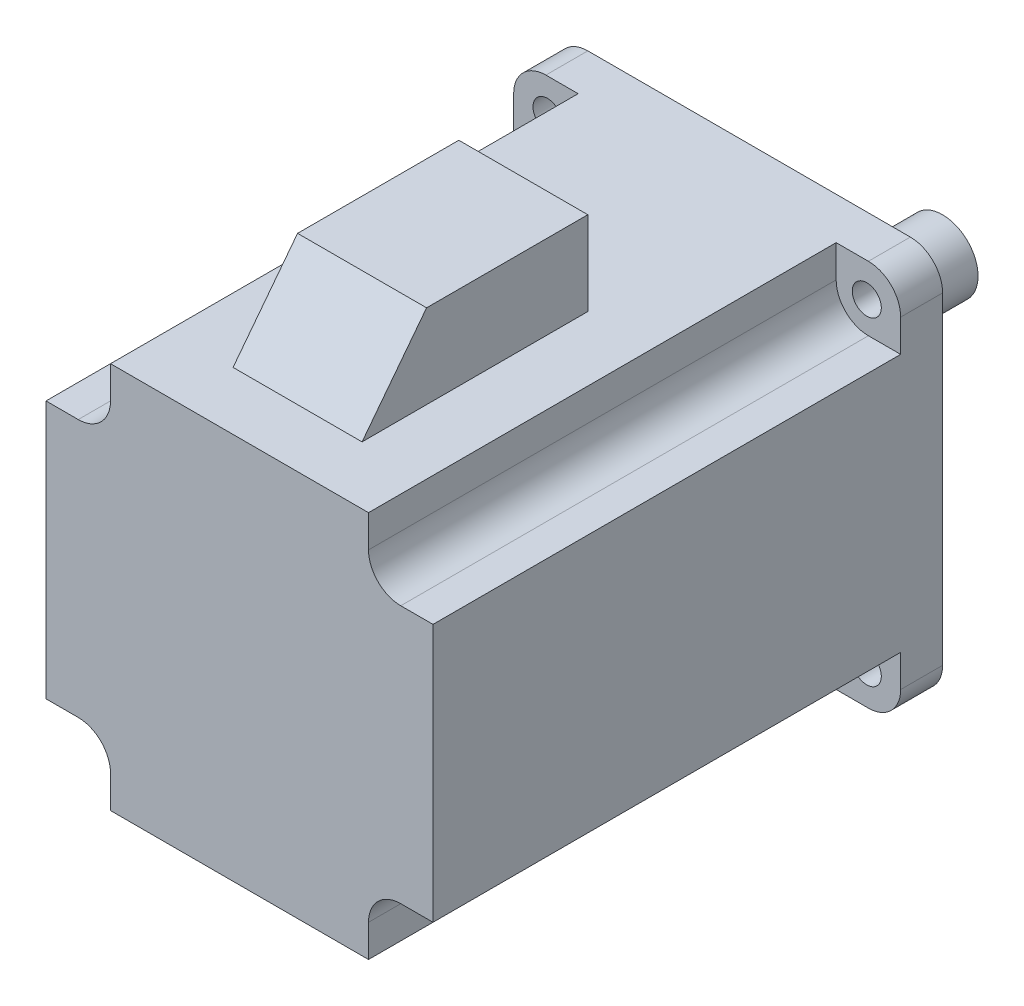
ISO-10303-21;
HEADER;
FILE_DESCRIPTION(('STEP AP214'),'2;1');
FILE_NAME('part.step','',(''),(''),'','','');
FILE_SCHEMA(('AUTOMOTIVE_DESIGN { 1 0 10303 214 1 1 1 1 }'));
ENDSEC;
DATA;
#1=APPLICATION_CONTEXT('core data for automotive mechanical design processes');
#2=APPLICATION_PROTOCOL_DEFINITION('international standard','automotive_design',2000,#1);
#3=PRODUCT_CONTEXT('',#1,'mechanical');
#4=PRODUCT('Part','Part','',(#3));
#5=PRODUCT_RELATED_PRODUCT_CATEGORY('part','',(#4));
#6=PRODUCT_DEFINITION_FORMATION('','',#4);
#7=PRODUCT_DEFINITION_CONTEXT('part definition',#1,'design');
#8=PRODUCT_DEFINITION('design','',#6,#7);
#9=PRODUCT_DEFINITION_SHAPE('','',#8);
#10=(LENGTH_UNIT() NAMED_UNIT(*) SI_UNIT(.MILLI.,.METRE.));
#11=(NAMED_UNIT(*) PLANE_ANGLE_UNIT() SI_UNIT($,.RADIAN.));
#12=(NAMED_UNIT(*) SI_UNIT($,.STERADIAN.) SOLID_ANGLE_UNIT());
#13=UNCERTAINTY_MEASURE_WITH_UNIT(LENGTH_MEASURE(1.E-05),#10,'distance_accuracy_value','');
#14=(GEOMETRIC_REPRESENTATION_CONTEXT(3) GLOBAL_UNCERTAINTY_ASSIGNED_CONTEXT((#13)) GLOBAL_UNIT_ASSIGNED_CONTEXT((#10,
#11,#12)) REPRESENTATION_CONTEXT('',''));
#15=CARTESIAN_POINT('',(0.,0.,0.));
#16=DIRECTION('',(0.,0.,1.));
#17=DIRECTION('',(1.,0.,0.));
#18=AXIS2_PLACEMENT_3D('',#15,#16,#17);
#19=CARTESIAN_POINT('',(0.,0.,-42.5));
#20=DIRECTION('',(0.,0.,-1.));
#21=DIRECTION('',(-1.,0.,0.));
#22=AXIS2_PLACEMENT_3D('',#19,#20,#21);
#23=PLANE('',#22);
#24=CARTESIAN_POINT('',(0.,0.,-42.5));
#25=DIRECTION('',(0.,0.,-1.));
#26=DIRECTION('',(-1.,0.,0.));
#27=AXIS2_PLACEMENT_3D('',#24,#25,#26);
#28=CIRCLE('',#27,25.);
#29=CARTESIAN_POINT('',(-25.,0.,-42.5));
#30=VERTEX_POINT('',#29);
#31=EDGE_CURVE('E340',#30,#30,#28,.T.);
#32=ORIENTED_EDGE('',*,*,#31,.T.);
#33=EDGE_LOOP('',(#32));
#34=FACE_BOUND('',#33,.T.);
#35=CARTESIAN_POINT('',(0.,0.,-42.5));
#36=DIRECTION('',(0.,0.,-1.));
#37=DIRECTION('',(-1.,0.,0.));
#38=AXIS2_PLACEMENT_3D('',#35,#36,#37);
#39=CIRCLE('',#38,5.5);
#40=CARTESIAN_POINT('',(-5.5,0.,-42.5));
#41=VERTEX_POINT('',#40);
#42=EDGE_CURVE('E333',#41,#41,#39,.T.);
#43=ORIENTED_EDGE('',*,*,#42,.F.);
#44=EDGE_LOOP('',(#43));
#45=FACE_BOUND('',#44,.T.);
#46=ADVANCED_FACE('F19',(#34,#45),#23,.T.);
#47=CARTESIAN_POINT('',(0.,0.,-39.5));
#48=DIRECTION('',(0.,0.,-1.));
#49=DIRECTION('',(-1.,0.,0.));
#50=AXIS2_PLACEMENT_3D('',#47,#48,#49);
#51=PLANE('',#50);
#52=CARTESIAN_POINT('',(24.7487373415294,-24.748737341529,-39.5));
#53=DIRECTION('',(0.,0.,-1.));
#54=DIRECTION('',(0.,1.,0.));
#55=AXIS2_PLACEMENT_3D('',#52,#53,#54);
#56=CIRCLE('',#55,2.25);
#57=CARTESIAN_POINT('',(24.7487373415294,-22.498737341529,-39.5));
#58=VERTEX_POINT('',#57);
#59=EDGE_CURVE('E237',#58,#58,#56,.T.);
#60=ORIENTED_EDGE('',*,*,#59,.F.);
#61=EDGE_LOOP('',(#60));
#62=FACE_BOUND('',#61,.T.);
#63=CARTESIAN_POINT('',(-24.7487373415292,-24.7487373415291,-39.5));
#64=DIRECTION('',(0.,0.,-1.));
#65=DIRECTION('',(1.,0.,0.));
#66=AXIS2_PLACEMENT_3D('',#63,#64,#65);
#67=CIRCLE('',#66,2.25);
#68=CARTESIAN_POINT('',(-22.4987373415292,-24.7487373415291,-39.5));
#69=VERTEX_POINT('',#68);
#70=EDGE_CURVE('E241',#69,#69,#67,.T.);
#71=ORIENTED_EDGE('',*,*,#70,.F.);
#72=EDGE_LOOP('',(#71));
#73=FACE_BOUND('',#72,.T.);
#74=CARTESIAN_POINT('',(-24.7487373415292,24.7487373415292,-39.5));
#75=DIRECTION('',(0.,0.,-1.));
#76=DIRECTION('',(0.,-1.,0.));
#77=AXIS2_PLACEMENT_3D('',#74,#75,#76);
#78=CIRCLE('',#77,2.25);
#79=CARTESIAN_POINT('',(-24.7487373415292,22.4987373415292,-39.5));
#80=VERTEX_POINT('',#79);
#81=EDGE_CURVE('E245',#80,#80,#78,.T.);
#82=ORIENTED_EDGE('',*,*,#81,.F.);
#83=EDGE_LOOP('',(#82));
#84=FACE_BOUND('',#83,.T.);
#85=CARTESIAN_POINT('',(24.7487373415292,24.7487373415291,-39.5));
#86=DIRECTION('',(0.,0.,-1.));
#87=DIRECTION('',(-1.,0.,0.));
#88=AXIS2_PLACEMENT_3D('',#85,#86,#87);
#89=CIRCLE('',#88,2.25);
#90=CARTESIAN_POINT('',(22.4987373415292,24.7487373415291,-39.5));
#91=VERTEX_POINT('',#90);
#92=EDGE_CURVE('E249',#91,#91,#89,.T.);
#93=ORIENTED_EDGE('',*,*,#92,.F.);
#94=EDGE_LOOP('',(#93));
#95=FACE_BOUND('',#94,.T.);
#96=DIRECTION('',(0.,1.,0.));
#97=VECTOR('',#96,1.);
#98=CARTESIAN_POINT('',(30.,-30.,-39.5));
#99=LINE('',#98,#97);
#100=CARTESIAN_POINT('',(30.,-25.,-39.5));
#101=VERTEX_POINT('',#100);
#102=CARTESIAN_POINT('',(30.,25.,-39.5));
#103=VERTEX_POINT('',#102);
#104=EDGE_CURVE('E343',#101,#103,#99,.T.);
#105=ORIENTED_EDGE('',*,*,#104,.F.);
#106=CARTESIAN_POINT('',(25.,-25.,-39.5));
#107=DIRECTION('',(0.,0.,-1.));
#108=DIRECTION('',(-1.,0.,0.));
#109=AXIS2_PLACEMENT_3D('',#106,#107,#108);
#110=CIRCLE('',#109,5.);
#111=CARTESIAN_POINT('',(25.,-30.,-39.5));
#112=VERTEX_POINT('',#111);
#113=EDGE_CURVE('E424',#101,#112,#110,.T.);
#114=ORIENTED_EDGE('',*,*,#113,.T.);
#115=DIRECTION('',(1.,0.,0.));
#116=VECTOR('',#115,1.);
#117=CARTESIAN_POINT('',(-30.,-30.,-39.5));
#118=LINE('',#117,#116);
#119=CARTESIAN_POINT('',(-25.,-30.,-39.5));
#120=VERTEX_POINT('',#119);
#121=EDGE_CURVE('E350',#120,#112,#118,.T.);
#122=ORIENTED_EDGE('',*,*,#121,.F.);
#123=CARTESIAN_POINT('',(-25.,-25.,-39.5));
#124=DIRECTION('',(0.,0.,-1.));
#125=DIRECTION('',(-1.,0.,0.));
#126=AXIS2_PLACEMENT_3D('',#123,#124,#125);
#127=CIRCLE('',#126,5.);
#128=CARTESIAN_POINT('',(-30.,-25.,-39.5));
#129=VERTEX_POINT('',#128);
#130=EDGE_CURVE('E422',#120,#129,#127,.T.);
#131=ORIENTED_EDGE('',*,*,#130,.T.);
#132=DIRECTION('',(0.,-1.,0.));
#133=VECTOR('',#132,1.);
#134=CARTESIAN_POINT('',(-30.,-30.,-39.5));
#135=LINE('',#134,#133);
#136=CARTESIAN_POINT('',(-30.,25.,-39.5));
#137=VERTEX_POINT('',#136);
#138=EDGE_CURVE('E365',#137,#129,#135,.T.);
#139=ORIENTED_EDGE('',*,*,#138,.F.);
#140=CARTESIAN_POINT('',(-25.,25.,-39.5));
#141=DIRECTION('',(0.,0.,-1.));
#142=DIRECTION('',(-1.,0.,0.));
#143=AXIS2_PLACEMENT_3D('',#140,#141,#142);
#144=CIRCLE('',#143,5.);
#145=CARTESIAN_POINT('',(-25.,30.,-39.5));
#146=VERTEX_POINT('',#145);
#147=EDGE_CURVE('E420',#137,#146,#144,.T.);
#148=ORIENTED_EDGE('',*,*,#147,.T.);
#149=DIRECTION('',(-1.,0.,0.));
#150=VECTOR('',#149,1.);
#151=CARTESIAN_POINT('',(-30.,30.,-39.5));
#152=LINE('',#151,#150);
#153=CARTESIAN_POINT('',(25.,30.,-39.5));
#154=VERTEX_POINT('',#153);
#155=EDGE_CURVE('E362',#154,#146,#152,.T.);
#156=ORIENTED_EDGE('',*,*,#155,.F.);
#157=CARTESIAN_POINT('',(25.,25.,-39.5));
#158=DIRECTION('',(0.,0.,-1.));
#159=DIRECTION('',(-1.,0.,0.));
#160=AXIS2_PLACEMENT_3D('',#157,#158,#159);
#161=CIRCLE('',#160,5.);
#162=EDGE_CURVE('E418',#154,#103,#161,.T.);
#163=ORIENTED_EDGE('',*,*,#162,.T.);
#164=EDGE_LOOP('',(#105,#114,#122,#131,#139,#148,#156,#163));
#165=FACE_BOUND('',#164,.T.);
#166=CARTESIAN_POINT('',(0.,0.,-39.5));
#167=DIRECTION('',(0.,0.,-1.));
#168=DIRECTION('',(-1.,0.,0.));
#169=AXIS2_PLACEMENT_3D('',#166,#167,#168);
#170=CIRCLE('',#169,25.);
#171=CARTESIAN_POINT('',(-25.,0.,-39.5));
#172=VERTEX_POINT('',#171);
#173=EDGE_CURVE('E337',#172,#172,#170,.T.);
#174=ORIENTED_EDGE('',*,*,#173,.F.);
#175=EDGE_LOOP('',(#174));
#176=FACE_BOUND('',#175,.T.);
#177=ADVANCED_FACE('F481',(#62,#73,#84,#95,#165,#176),#51,.T.);
#178=CARTESIAN_POINT('',(30.,-30.,39.5));
#179=DIRECTION('',(-1.,0.,0.));
#180=DIRECTION('',(0.,0.,1.));
#181=AXIS2_PLACEMENT_3D('',#178,#179,#180);
#182=PLANE('',#181);
#183=DIRECTION('',(0.,1.,0.));
#184=VECTOR('',#183,1.);
#185=CARTESIAN_POINT('',(30.,-30.,-33.));
#186=LINE('',#185,#184);
#187=CARTESIAN_POINT('',(30.,-25.,-33.));
#188=VERTEX_POINT('',#187);
#189=CARTESIAN_POINT('',(30.,-20.,-33.));
#190=VERTEX_POINT('',#189);
#191=EDGE_CURVE('E262',#188,#190,#186,.T.);
#192=ORIENTED_EDGE('',*,*,#191,.F.);
#193=DIRECTION('',(0.,0.,-1.));
#194=VECTOR('',#193,1.);
#195=CARTESIAN_POINT('',(30.,-25.,39.5));
#196=LINE('',#195,#194);
#197=EDGE_CURVE('E415',#188,#101,#196,.T.);
#198=ORIENTED_EDGE('',*,*,#197,.T.);
#199=ORIENTED_EDGE('',*,*,#104,.T.);
#200=DIRECTION('',(0.,0.,-1.));
#201=VECTOR('',#200,1.);
#202=CARTESIAN_POINT('',(30.,25.,39.5));
#203=LINE('',#202,#201);
#204=CARTESIAN_POINT('',(30.,25.,-33.));
#205=VERTEX_POINT('',#204);
#206=EDGE_CURVE('E413',#103,#205,#203,.F.);
#207=ORIENTED_EDGE('',*,*,#206,.T.);
#208=DIRECTION('',(0.,1.,0.));
#209=VECTOR('',#208,1.);
#210=CARTESIAN_POINT('',(30.,30.,-33.));
#211=LINE('',#210,#209);
#212=CARTESIAN_POINT('',(30.,20.,-33.));
#213=VERTEX_POINT('',#212);
#214=EDGE_CURVE('E301',#213,#205,#211,.T.);
#215=ORIENTED_EDGE('',*,*,#214,.F.);
#216=DIRECTION('',(0.,0.,1.));
#217=VECTOR('',#216,1.);
#218=CARTESIAN_POINT('',(30.,20.,-53.642135623731));
#219=LINE('',#218,#217);
#220=CARTESIAN_POINT('',(30.,20.,39.5));
#221=VERTEX_POINT('',#220);
#222=EDGE_CURVE('E305',#213,#221,#219,.T.);
#223=ORIENTED_EDGE('',*,*,#222,.T.);
#224=DIRECTION('',(0.,1.,0.));
#225=VECTOR('',#224,1.);
#226=CARTESIAN_POINT('',(30.,-30.,39.5));
#227=LINE('',#226,#225);
#228=CARTESIAN_POINT('',(30.,-20.,39.5));
#229=VERTEX_POINT('',#228);
#230=EDGE_CURVE('E346',#229,#221,#227,.T.);
#231=ORIENTED_EDGE('',*,*,#230,.F.);
#232=DIRECTION('',(0.,0.,1.));
#233=VECTOR('',#232,1.);
#234=CARTESIAN_POINT('',(30.,-20.,-53.642135623731));
#235=LINE('',#234,#233);
#236=EDGE_CURVE('E264',#190,#229,#235,.T.);
#237=ORIENTED_EDGE('',*,*,#236,.F.);
#238=EDGE_LOOP('',(#192,#198,#199,#207,#215,#223,#231,#237));
#239=FACE_BOUND('',#238,.T.);
#240=ADVANCED_FACE('F490',(#239),#182,.F.);
#241=CARTESIAN_POINT('',(-30.,30.,39.5));
#242=DIRECTION('',(0.,-1.,0.));
#243=DIRECTION('',(0.,0.,-1.));
#244=AXIS2_PLACEMENT_3D('',#241,#242,#243);
#245=PLANE('',#244);
#246=DIRECTION('',(-1.,0.,0.));
#247=VECTOR('',#246,1.);
#248=CARTESIAN_POINT('',(10.,30.,-4.5));
#249=LINE('',#248,#247);
#250=CARTESIAN_POINT('',(10.,30.,-4.5));
#251=VERTEX_POINT('',#250);
#252=CARTESIAN_POINT('',(-10.,30.,-4.5));
#253=VERTEX_POINT('',#252);
#254=EDGE_CURVE('E34',#251,#253,#249,.T.);
#255=ORIENTED_EDGE('',*,*,#254,.F.);
#256=DIRECTION('',(0.,0.,-1.));
#257=VECTOR('',#256,1.);
#258=CARTESIAN_POINT('',(10.,30.,-4.5));
#259=LINE('',#258,#257);
#260=CARTESIAN_POINT('',(10.,30.,30.5));
#261=VERTEX_POINT('',#260);
#262=EDGE_CURVE('E39',#261,#251,#259,.T.);
#263=ORIENTED_EDGE('',*,*,#262,.F.);
#264=DIRECTION('',(-1.,0.,0.));
#265=VECTOR('',#264,1.);
#266=CARTESIAN_POINT('',(10.,30.,30.5));
#267=LINE('',#266,#265);
#268=CARTESIAN_POINT('',(-10.,30.,30.5));
#269=VERTEX_POINT('',#268);
#270=EDGE_CURVE('E222',#261,#269,#267,.T.);
#271=ORIENTED_EDGE('',*,*,#270,.T.);
#272=DIRECTION('',(0.,0.,-1.));
#273=VECTOR('',#272,1.);
#274=CARTESIAN_POINT('',(-10.,30.,-4.5));
#275=LINE('',#274,#273);
#276=EDGE_CURVE('E226',#269,#253,#275,.T.);
#277=ORIENTED_EDGE('',*,*,#276,.T.);
#278=EDGE_LOOP('',(#255,#263,#271,#277));
#279=FACE_BOUND('',#278,.T.);
#280=ORIENTED_EDGE('',*,*,#155,.T.);
#281=DIRECTION('',(0.,0.,-1.));
#282=VECTOR('',#281,1.);
#283=CARTESIAN_POINT('',(-25.,30.,39.5));
#284=LINE('',#283,#282);
#285=CARTESIAN_POINT('',(-25.,30.,-33.));
#286=VERTEX_POINT('',#285);
#287=EDGE_CURVE('E439',#146,#286,#284,.F.);
#288=ORIENTED_EDGE('',*,*,#287,.T.);
#289=DIRECTION('',(-1.,0.,0.));
#290=VECTOR('',#289,1.);
#291=CARTESIAN_POINT('',(-30.,30.,-33.));
#292=LINE('',#291,#290);
#293=CARTESIAN_POINT('',(-20.,30.,-33.));
#294=VERTEX_POINT('',#293);
#295=EDGE_CURVE('E325',#294,#286,#292,.T.);
#296=ORIENTED_EDGE('',*,*,#295,.F.);
#297=DIRECTION('',(0.,0.,1.));
#298=VECTOR('',#297,1.);
#299=CARTESIAN_POINT('',(-20.,30.,-53.642135623731));
#300=LINE('',#299,#298);
#301=CARTESIAN_POINT('',(-20.,30.,39.5));
#302=VERTEX_POINT('',#301);
#303=EDGE_CURVE('E328',#294,#302,#300,.T.);
#304=ORIENTED_EDGE('',*,*,#303,.T.);
#305=DIRECTION('',(-1.,0.,0.));
#306=VECTOR('',#305,1.);
#307=CARTESIAN_POINT('',(-30.,30.,39.5));
#308=LINE('',#307,#306);
#309=CARTESIAN_POINT('',(20.,30.,39.5));
#310=VERTEX_POINT('',#309);
#311=EDGE_CURVE('E349',#310,#302,#308,.T.);
#312=ORIENTED_EDGE('',*,*,#311,.F.);
#313=DIRECTION('',(0.,0.,1.));
#314=VECTOR('',#313,1.);
#315=CARTESIAN_POINT('',(20.,30.,-53.642135623731));
#316=LINE('',#315,#314);
#317=CARTESIAN_POINT('',(20.,30.,-33.));
#318=VERTEX_POINT('',#317);
#319=EDGE_CURVE('E300',#318,#310,#316,.T.);
#320=ORIENTED_EDGE('',*,*,#319,.F.);
#321=DIRECTION('',(-1.,0.,0.));
#322=VECTOR('',#321,1.);
#323=CARTESIAN_POINT('',(30.,30.,-33.));
#324=LINE('',#323,#322);
#325=CARTESIAN_POINT('',(25.,30.,-33.));
#326=VERTEX_POINT('',#325);
#327=EDGE_CURVE('E296',#326,#318,#324,.T.);
#328=ORIENTED_EDGE('',*,*,#327,.F.);
#329=DIRECTION('',(0.,0.,-1.));
#330=VECTOR('',#329,1.);
#331=CARTESIAN_POINT('',(25.,30.,39.5));
#332=LINE('',#331,#330);
#333=EDGE_CURVE('E436',#326,#154,#332,.T.);
#334=ORIENTED_EDGE('',*,*,#333,.T.);
#335=EDGE_LOOP('',(#280,#288,#296,#304,#312,#320,#328,#334));
#336=FACE_BOUND('',#335,.T.);
#337=ADVANCED_FACE('F531',(#279,#336),#245,.F.);
#338=CARTESIAN_POINT('',(-30.,-30.,39.5));
#339=DIRECTION('',(1.,0.,0.));
#340=DIRECTION('',(0.,1.,0.));
#341=AXIS2_PLACEMENT_3D('',#338,#339,#340);
#342=PLANE('',#341);
#343=ORIENTED_EDGE('',*,*,#138,.T.);
#344=DIRECTION('',(0.,0.,-1.));
#345=VECTOR('',#344,1.);
#346=CARTESIAN_POINT('',(-30.,-25.,39.5));
#347=LINE('',#346,#345);
#348=CARTESIAN_POINT('',(-30.,-25.,-33.));
#349=VERTEX_POINT('',#348);
#350=EDGE_CURVE('E434',#129,#349,#347,.F.);
#351=ORIENTED_EDGE('',*,*,#350,.T.);
#352=DIRECTION('',(0.,-1.,0.));
#353=VECTOR('',#352,1.);
#354=CARTESIAN_POINT('',(-30.,-30.,-33.));
#355=LINE('',#354,#353);
#356=CARTESIAN_POINT('',(-30.,-20.,-33.));
#357=VERTEX_POINT('',#356);
#358=EDGE_CURVE('E281',#357,#349,#355,.T.);
#359=ORIENTED_EDGE('',*,*,#358,.F.);
#360=DIRECTION('',(0.,0.,1.));
#361=VECTOR('',#360,1.);
#362=CARTESIAN_POINT('',(-30.,-20.,-53.642135623731));
#363=LINE('',#362,#361);
#364=CARTESIAN_POINT('',(-30.,-20.,39.5));
#365=VERTEX_POINT('',#364);
#366=EDGE_CURVE('E285',#357,#365,#363,.T.);
#367=ORIENTED_EDGE('',*,*,#366,.T.);
#368=DIRECTION('',(0.,-1.,0.));
#369=VECTOR('',#368,1.);
#370=CARTESIAN_POINT('',(-30.,-30.,39.5));
#371=LINE('',#370,#369);
#372=CARTESIAN_POINT('',(-30.,20.,39.5));
#373=VERTEX_POINT('',#372);
#374=EDGE_CURVE('E353',#373,#365,#371,.T.);
#375=ORIENTED_EDGE('',*,*,#374,.F.);
#376=DIRECTION('',(0.,0.,1.));
#377=VECTOR('',#376,1.);
#378=CARTESIAN_POINT('',(-30.,20.,-53.642135623731));
#379=LINE('',#378,#377);
#380=CARTESIAN_POINT('',(-30.,20.,-33.));
#381=VERTEX_POINT('',#380);
#382=EDGE_CURVE('E324',#381,#373,#379,.T.);
#383=ORIENTED_EDGE('',*,*,#382,.F.);
#384=DIRECTION('',(0.,-1.,0.));
#385=VECTOR('',#384,1.);
#386=CARTESIAN_POINT('',(-30.,30.,-33.));
#387=LINE('',#386,#385);
#388=CARTESIAN_POINT('',(-30.,25.,-33.));
#389=VERTEX_POINT('',#388);
#390=EDGE_CURVE('E322',#389,#381,#387,.T.);
#391=ORIENTED_EDGE('',*,*,#390,.F.);
#392=DIRECTION('',(0.,0.,-1.));
#393=VECTOR('',#392,1.);
#394=CARTESIAN_POINT('',(-30.,25.,39.5));
#395=LINE('',#394,#393);
#396=EDGE_CURVE('E431',#389,#137,#395,.T.);
#397=ORIENTED_EDGE('',*,*,#396,.T.);
#398=EDGE_LOOP('',(#343,#351,#359,#367,#375,#383,#391,#397));
#399=FACE_BOUND('',#398,.T.);
#400=ADVANCED_FACE('F468',(#399),#342,.F.);
#401=CARTESIAN_POINT('',(-30.,-30.,39.5));
#402=DIRECTION('',(0.,1.,0.));
#403=DIRECTION('',(0.,0.,1.));
#404=AXIS2_PLACEMENT_3D('',#401,#402,#403);
#405=PLANE('',#404);
#406=ORIENTED_EDGE('',*,*,#121,.T.);
#407=DIRECTION('',(0.,0.,-1.));
#408=VECTOR('',#407,1.);
#409=CARTESIAN_POINT('',(25.,-30.,39.5));
#410=LINE('',#409,#408);
#411=CARTESIAN_POINT('',(25.,-30.,-33.));
#412=VERTEX_POINT('',#411);
#413=EDGE_CURVE('E429',#112,#412,#410,.F.);
#414=ORIENTED_EDGE('',*,*,#413,.T.);
#415=DIRECTION('',(1.,0.,0.));
#416=VECTOR('',#415,1.);
#417=CARTESIAN_POINT('',(30.,-30.,-33.));
#418=LINE('',#417,#416);
#419=CARTESIAN_POINT('',(20.,-30.,-33.));
#420=VERTEX_POINT('',#419);
#421=EDGE_CURVE('E265',#420,#412,#418,.T.);
#422=ORIENTED_EDGE('',*,*,#421,.F.);
#423=DIRECTION('',(0.,0.,1.));
#424=VECTOR('',#423,1.);
#425=CARTESIAN_POINT('',(20.,-30.,-53.642135623731));
#426=LINE('',#425,#424);
#427=CARTESIAN_POINT('',(20.,-30.,39.5));
#428=VERTEX_POINT('',#427);
#429=EDGE_CURVE('E268',#420,#428,#426,.T.);
#430=ORIENTED_EDGE('',*,*,#429,.T.);
#431=DIRECTION('',(1.,0.,0.));
#432=VECTOR('',#431,1.);
#433=CARTESIAN_POINT('',(-30.,-30.,39.5));
#434=LINE('',#433,#432);
#435=CARTESIAN_POINT('',(-20.,-30.,39.5));
#436=VERTEX_POINT('',#435);
#437=EDGE_CURVE('E356',#436,#428,#434,.T.);
#438=ORIENTED_EDGE('',*,*,#437,.F.);
#439=DIRECTION('',(0.,0.,1.));
#440=VECTOR('',#439,1.);
#441=CARTESIAN_POINT('',(-20.,-30.,-53.642135623731));
#442=LINE('',#441,#440);
#443=CARTESIAN_POINT('',(-20.,-30.,-33.));
#444=VERTEX_POINT('',#443);
#445=EDGE_CURVE('E280',#444,#436,#442,.T.);
#446=ORIENTED_EDGE('',*,*,#445,.F.);
#447=DIRECTION('',(1.,0.,0.));
#448=VECTOR('',#447,1.);
#449=CARTESIAN_POINT('',(-30.,-30.,-33.));
#450=LINE('',#449,#448);
#451=CARTESIAN_POINT('',(-25.,-30.,-33.));
#452=VERTEX_POINT('',#451);
#453=EDGE_CURVE('E276',#452,#444,#450,.T.);
#454=ORIENTED_EDGE('',*,*,#453,.F.);
#455=DIRECTION('',(0.,0.,-1.));
#456=VECTOR('',#455,1.);
#457=CARTESIAN_POINT('',(-25.,-30.,39.5));
#458=LINE('',#457,#456);
#459=EDGE_CURVE('E426',#452,#120,#458,.T.);
#460=ORIENTED_EDGE('',*,*,#459,.T.);
#461=EDGE_LOOP('',(#406,#414,#422,#430,#438,#446,#454,#460));
#462=FACE_BOUND('',#461,.T.);
#463=ADVANCED_FACE('F477',(#462),#405,.F.);
#464=CARTESIAN_POINT('',(0.,0.,39.5));
#465=DIRECTION('',(0.,0.,-1.));
#466=DIRECTION('',(-1.,0.,0.));
#467=AXIS2_PLACEMENT_3D('',#464,#465,#466);
#468=PLANE('',#467);
#469=DIRECTION('',(0.,-1.,0.));
#470=VECTOR('',#469,1.);
#471=CARTESIAN_POINT('',(20.,-30.,39.5));
#472=LINE('',#471,#470);
#473=CARTESIAN_POINT('',(20.,-25.,39.5));
#474=VERTEX_POINT('',#473);
#475=EDGE_CURVE('E253',#474,#428,#472,.T.);
#476=ORIENTED_EDGE('',*,*,#475,.F.);
#477=CARTESIAN_POINT('',(25.,-25.,39.5));
#478=DIRECTION('',(0.,0.,-1.));
#479=DIRECTION('',(-1.,0.,0.));
#480=AXIS2_PLACEMENT_3D('',#477,#478,#479);
#481=CIRCLE('',#480,5.);
#482=CARTESIAN_POINT('',(25.,-20.,39.5));
#483=VERTEX_POINT('',#482);
#484=EDGE_CURVE('E12',#474,#483,#481,.T.);
#485=ORIENTED_EDGE('',*,*,#484,.T.);
#486=DIRECTION('',(-1.,0.,0.));
#487=VECTOR('',#486,1.);
#488=CARTESIAN_POINT('',(30.,-20.,39.5));
#489=LINE('',#488,#487);
#490=EDGE_CURVE('E256',#229,#483,#489,.T.);
#491=ORIENTED_EDGE('',*,*,#490,.F.);
#492=ORIENTED_EDGE('',*,*,#230,.T.);
#493=DIRECTION('',(1.,0.,0.));
#494=VECTOR('',#493,1.);
#495=CARTESIAN_POINT('',(30.,20.,39.5));
#496=LINE('',#495,#494);
#497=CARTESIAN_POINT('',(25.,20.,39.5));
#498=VERTEX_POINT('',#497);
#499=EDGE_CURVE('E294',#498,#221,#496,.T.);
#500=ORIENTED_EDGE('',*,*,#499,.F.);
#501=CARTESIAN_POINT('',(25.,25.,39.5));
#502=DIRECTION('',(0.,0.,-1.));
#503=DIRECTION('',(-1.,0.,0.));
#504=AXIS2_PLACEMENT_3D('',#501,#502,#503);
#505=CIRCLE('',#504,5.);
#506=CARTESIAN_POINT('',(20.,25.,39.5));
#507=VERTEX_POINT('',#506);
#508=EDGE_CURVE('E441',#498,#507,#505,.T.);
#509=ORIENTED_EDGE('',*,*,#508,.T.);
#510=DIRECTION('',(0.,-1.,0.));
#511=VECTOR('',#510,1.);
#512=CARTESIAN_POINT('',(20.,30.,39.5));
#513=LINE('',#512,#511);
#514=EDGE_CURVE('E284',#310,#507,#513,.T.);
#515=ORIENTED_EDGE('',*,*,#514,.F.);
#516=ORIENTED_EDGE('',*,*,#311,.T.);
#517=DIRECTION('',(0.,1.,0.));
#518=VECTOR('',#517,1.);
#519=CARTESIAN_POINT('',(-20.,30.,39.5));
#520=LINE('',#519,#518);
#521=CARTESIAN_POINT('',(-20.,25.,39.5));
#522=VERTEX_POINT('',#521);
#523=EDGE_CURVE('E314',#522,#302,#520,.T.);
#524=ORIENTED_EDGE('',*,*,#523,.F.);
#525=CARTESIAN_POINT('',(-25.,25.,39.5));
#526=DIRECTION('',(0.,0.,-1.));
#527=DIRECTION('',(-1.,0.,0.));
#528=AXIS2_PLACEMENT_3D('',#525,#526,#527);
#529=CIRCLE('',#528,5.);
#530=CARTESIAN_POINT('',(-25.,20.,39.5));
#531=VERTEX_POINT('',#530);
#532=EDGE_CURVE('E443',#522,#531,#529,.T.);
#533=ORIENTED_EDGE('',*,*,#532,.T.);
#534=DIRECTION('',(1.,0.,0.));
#535=VECTOR('',#534,1.);
#536=CARTESIAN_POINT('',(-30.,20.,39.5));
#537=LINE('',#536,#535);
#538=EDGE_CURVE('E304',#373,#531,#537,.T.);
#539=ORIENTED_EDGE('',*,*,#538,.F.);
#540=ORIENTED_EDGE('',*,*,#374,.T.);
#541=DIRECTION('',(-1.,0.,0.));
#542=VECTOR('',#541,1.);
#543=CARTESIAN_POINT('',(-30.,-20.,39.5));
#544=LINE('',#543,#542);
#545=CARTESIAN_POINT('',(-25.,-20.,39.5));
#546=VERTEX_POINT('',#545);
#547=EDGE_CURVE('E274',#546,#365,#544,.T.);
#548=ORIENTED_EDGE('',*,*,#547,.F.);
#549=CARTESIAN_POINT('',(-25.,-25.,39.5));
#550=DIRECTION('',(0.,0.,-1.));
#551=DIRECTION('',(-1.,0.,0.));
#552=AXIS2_PLACEMENT_3D('',#549,#550,#551);
#553=CIRCLE('',#552,5.);
#554=CARTESIAN_POINT('',(-20.,-25.,39.5));
#555=VERTEX_POINT('',#554);
#556=EDGE_CURVE('E27',#546,#555,#553,.T.);
#557=ORIENTED_EDGE('',*,*,#556,.T.);
#558=DIRECTION('',(0.,1.,0.));
#559=VECTOR('',#558,1.);
#560=CARTESIAN_POINT('',(-20.,-30.,39.5));
#561=LINE('',#560,#559);
#562=EDGE_CURVE('E273',#436,#555,#561,.T.);
#563=ORIENTED_EDGE('',*,*,#562,.F.);
#564=ORIENTED_EDGE('',*,*,#437,.T.);
#565=EDGE_LOOP('',(#476,#485,#491,#492,#500,#509,#515,#516,#524,#533,#539,#540,#548,#557,#563,#564));
#566=FACE_BOUND('',#565,.T.);
#567=ADVANCED_FACE('F448',(#566),#468,.F.);
#568=CARTESIAN_POINT('',(0.,0.,-42.5));
#569=DIRECTION('',(0.,0.,1.));
#570=DIRECTION('',(1.,0.,0.));
#571=AXIS2_PLACEMENT_3D('',#568,#569,#570);
#572=CYLINDRICAL_SURFACE('',#571,25.);
#573=ORIENTED_EDGE('',*,*,#31,.F.);
#574=EDGE_LOOP('',(#573));
#575=FACE_BOUND('',#574,.T.);
#576=ORIENTED_EDGE('',*,*,#173,.T.);
#577=EDGE_LOOP('',(#576));
#578=FACE_BOUND('',#577,.T.);
#579=ADVANCED_FACE('F580',(#575,#578),#572,.T.);
#580=CARTESIAN_POINT('',(0.,0.,-69.5));
#581=DIRECTION('',(0.,0.,1.));
#582=DIRECTION('',(1.,0.,0.));
#583=AXIS2_PLACEMENT_3D('',#580,#581,#582);
#584=CYLINDRICAL_SURFACE('',#583,5.5);
#585=CARTESIAN_POINT('',(0.,0.,-69.5));
#586=DIRECTION('',(0.,0.,-1.));
#587=DIRECTION('',(-1.,0.,0.));
#588=AXIS2_PLACEMENT_3D('',#585,#586,#587);
#589=CIRCLE('',#588,5.5);
#590=CARTESIAN_POINT('',(-5.5,0.,-69.5));
#591=VERTEX_POINT('',#590);
#592=EDGE_CURVE('E334',#591,#591,#589,.T.);
#593=ORIENTED_EDGE('',*,*,#592,.F.);
#594=EDGE_LOOP('',(#593));
#595=FACE_BOUND('',#594,.T.);
#596=ORIENTED_EDGE('',*,*,#42,.T.);
#597=EDGE_LOOP('',(#596));
#598=FACE_BOUND('',#597,.T.);
#599=ADVANCED_FACE('F578',(#595,#598),#584,.T.);
#600=CARTESIAN_POINT('',(0.,0.,-69.5));
#601=DIRECTION('',(0.,0.,-1.));
#602=DIRECTION('',(-1.,0.,0.));
#603=AXIS2_PLACEMENT_3D('',#600,#601,#602);
#604=PLANE('',#603);
#605=ORIENTED_EDGE('',*,*,#592,.T.);
#606=EDGE_LOOP('',(#605));
#607=FACE_BOUND('',#606,.T.);
#608=ADVANCED_FACE('F794',(#607),#604,.T.);
#609=CARTESIAN_POINT('',(0.,0.,-33.));
#610=DIRECTION('',(0.,0.,-1.));
#611=DIRECTION('',(-1.,0.,0.));
#612=AXIS2_PLACEMENT_3D('',#609,#610,#611);
#613=PLANE('',#612);
#614=CARTESIAN_POINT('',(-24.7487373415292,24.7487373415292,-33.));
#615=DIRECTION('',(0.,0.,-1.));
#616=DIRECTION('',(-1.,0.,0.));
#617=AXIS2_PLACEMENT_3D('',#614,#615,#616);
#618=CIRCLE('',#617,2.25);
#619=CARTESIAN_POINT('',(-26.9987373415292,24.7487373415292,-33.));
#620=VERTEX_POINT('',#619);
#621=EDGE_CURVE('E248',#620,#620,#618,.T.);
#622=ORIENTED_EDGE('',*,*,#621,.T.);
#623=EDGE_LOOP('',(#622));
#624=FACE_BOUND('',#623,.T.);
#625=DIRECTION('',(1.,0.,0.));
#626=VECTOR('',#625,1.);
#627=CARTESIAN_POINT('',(-30.,20.,-33.));
#628=LINE('',#627,#626);
#629=CARTESIAN_POINT('',(-25.,20.,-33.));
#630=VERTEX_POINT('',#629);
#631=EDGE_CURVE('E316',#381,#630,#628,.T.);
#632=ORIENTED_EDGE('',*,*,#631,.T.);
#633=CARTESIAN_POINT('',(-25.,25.,-33.));
#634=DIRECTION('',(0.,0.,-1.));
#635=DIRECTION('',(-1.,0.,0.));
#636=AXIS2_PLACEMENT_3D('',#633,#634,#635);
#637=CIRCLE('',#636,5.);
#638=CARTESIAN_POINT('',(-20.,25.,-33.));
#639=VERTEX_POINT('',#638);
#640=EDGE_CURVE('E393',#630,#639,#637,.F.);
#641=ORIENTED_EDGE('',*,*,#640,.T.);
#642=DIRECTION('',(0.,1.,0.));
#643=VECTOR('',#642,1.);
#644=CARTESIAN_POINT('',(-20.,30.,-33.));
#645=LINE('',#644,#643);
#646=EDGE_CURVE('E321',#639,#294,#645,.T.);
#647=ORIENTED_EDGE('',*,*,#646,.T.);
#648=ORIENTED_EDGE('',*,*,#295,.T.);
#649=CARTESIAN_POINT('',(-25.,25.,-33.));
#650=DIRECTION('',(0.,0.,-1.));
#651=DIRECTION('',(-1.,0.,0.));
#652=AXIS2_PLACEMENT_3D('',#649,#650,#651);
#653=CIRCLE('',#652,5.);
#654=EDGE_CURVE('E391',#286,#389,#653,.F.);
#655=ORIENTED_EDGE('',*,*,#654,.T.);
#656=ORIENTED_EDGE('',*,*,#390,.T.);
#657=EDGE_LOOP('',(#632,#641,#647,#648,#655,#656));
#658=FACE_BOUND('',#657,.T.);
#659=ADVANCED_FACE('F550',(#624,#658),#613,.F.);
#660=CARTESIAN_POINT('',(-30.,20.,-53.642135623731));
#661=DIRECTION('',(0.,-1.,0.));
#662=DIRECTION('',(0.,0.,-1.));
#663=AXIS2_PLACEMENT_3D('',#660,#661,#662);
#664=PLANE('',#663);
#665=ORIENTED_EDGE('',*,*,#538,.T.);
#666=DIRECTION('',(0.,0.,1.));
#667=VECTOR('',#666,1.);
#668=CARTESIAN_POINT('',(-25.,20.,-33.));
#669=LINE('',#668,#667);
#670=EDGE_CURVE('E389',#531,#630,#669,.F.);
#671=ORIENTED_EDGE('',*,*,#670,.T.);
#672=ORIENTED_EDGE('',*,*,#631,.F.);
#673=ORIENTED_EDGE('',*,*,#382,.T.);
#674=EDGE_LOOP('',(#665,#671,#672,#673));
#675=FACE_BOUND('',#674,.T.);
#676=ADVANCED_FACE('F547',(#675),#664,.F.);
#677=CARTESIAN_POINT('',(-20.,30.,-53.642135623731));
#678=DIRECTION('',(1.,0.,0.));
#679=DIRECTION('',(0.,0.,-1.));
#680=AXIS2_PLACEMENT_3D('',#677,#678,#679);
#681=PLANE('',#680);
#682=ORIENTED_EDGE('',*,*,#646,.F.);
#683=DIRECTION('',(0.,0.,1.));
#684=VECTOR('',#683,1.);
#685=CARTESIAN_POINT('',(-20.,25.,39.5));
#686=LINE('',#685,#684);
#687=EDGE_CURVE('E386',#639,#522,#686,.T.);
#688=ORIENTED_EDGE('',*,*,#687,.T.);
#689=ORIENTED_EDGE('',*,*,#523,.T.);
#690=ORIENTED_EDGE('',*,*,#303,.F.);
#691=EDGE_LOOP('',(#682,#688,#689,#690));
#692=FACE_BOUND('',#691,.T.);
#693=ADVANCED_FACE('F539',(#692),#681,.F.);
#694=CARTESIAN_POINT('',(0.,0.,-33.));
#695=DIRECTION('',(0.,0.,-1.));
#696=DIRECTION('',(-1.,0.,0.));
#697=AXIS2_PLACEMENT_3D('',#694,#695,#696);
#698=PLANE('',#697);
#699=CARTESIAN_POINT('',(24.7487373415292,24.7487373415291,-33.));
#700=DIRECTION('',(0.,0.,-1.));
#701=DIRECTION('',(-1.,0.,0.));
#702=AXIS2_PLACEMENT_3D('',#699,#700,#701);
#703=CIRCLE('',#702,2.25);
#704=CARTESIAN_POINT('',(22.4987373415292,24.7487373415291,-33.));
#705=VERTEX_POINT('',#704);
#706=EDGE_CURVE('E252',#705,#705,#703,.T.);
#707=ORIENTED_EDGE('',*,*,#706,.T.);
#708=EDGE_LOOP('',(#707));
#709=FACE_BOUND('',#708,.T.);
#710=DIRECTION('',(0.,-1.,0.));
#711=VECTOR('',#710,1.);
#712=CARTESIAN_POINT('',(20.,30.,-33.));
#713=LINE('',#712,#711);
#714=CARTESIAN_POINT('',(20.,25.,-33.));
#715=VERTEX_POINT('',#714);
#716=EDGE_CURVE('E308',#318,#715,#713,.T.);
#717=ORIENTED_EDGE('',*,*,#716,.T.);
#718=CARTESIAN_POINT('',(25.,25.,-33.));
#719=DIRECTION('',(0.,0.,-1.));
#720=DIRECTION('',(-1.,0.,0.));
#721=AXIS2_PLACEMENT_3D('',#718,#719,#720);
#722=CIRCLE('',#721,5.);
#723=CARTESIAN_POINT('',(25.,20.,-33.));
#724=VERTEX_POINT('',#723);
#725=EDGE_CURVE('E384',#715,#724,#722,.F.);
#726=ORIENTED_EDGE('',*,*,#725,.T.);
#727=DIRECTION('',(1.,0.,0.));
#728=VECTOR('',#727,1.);
#729=CARTESIAN_POINT('',(30.,20.,-33.));
#730=LINE('',#729,#728);
#731=EDGE_CURVE('E306',#724,#213,#730,.T.);
#732=ORIENTED_EDGE('',*,*,#731,.T.);
#733=ORIENTED_EDGE('',*,*,#214,.T.);
#734=CARTESIAN_POINT('',(25.,25.,-33.));
#735=DIRECTION('',(0.,0.,-1.));
#736=DIRECTION('',(-1.,0.,0.));
#737=AXIS2_PLACEMENT_3D('',#734,#735,#736);
#738=CIRCLE('',#737,5.);
#739=EDGE_CURVE('E382',#205,#326,#738,.F.);
#740=ORIENTED_EDGE('',*,*,#739,.T.);
#741=ORIENTED_EDGE('',*,*,#327,.T.);
#742=EDGE_LOOP('',(#717,#726,#732,#733,#740,#741));
#743=FACE_BOUND('',#742,.T.);
#744=ADVANCED_FACE('F528',(#709,#743),#698,.F.);
#745=CARTESIAN_POINT('',(20.,30.,-53.642135623731));
#746=DIRECTION('',(-1.,0.,0.));
#747=DIRECTION('',(0.,-1.,0.));
#748=AXIS2_PLACEMENT_3D('',#745,#746,#747);
#749=PLANE('',#748);
#750=ORIENTED_EDGE('',*,*,#514,.T.);
#751=DIRECTION('',(0.,0.,1.));
#752=VECTOR('',#751,1.);
#753=CARTESIAN_POINT('',(20.,25.,-33.));
#754=LINE('',#753,#752);
#755=EDGE_CURVE('E380',#507,#715,#754,.F.);
#756=ORIENTED_EDGE('',*,*,#755,.T.);
#757=ORIENTED_EDGE('',*,*,#716,.F.);
#758=ORIENTED_EDGE('',*,*,#319,.T.);
#759=EDGE_LOOP('',(#750,#756,#757,#758));
#760=FACE_BOUND('',#759,.T.);
#761=ADVANCED_FACE('F522',(#760),#749,.F.);
#762=CARTESIAN_POINT('',(30.,20.,-53.642135623731));
#763=DIRECTION('',(0.,-1.,0.));
#764=DIRECTION('',(1.,0.,0.));
#765=AXIS2_PLACEMENT_3D('',#762,#763,#764);
#766=PLANE('',#765);
#767=ORIENTED_EDGE('',*,*,#731,.F.);
#768=DIRECTION('',(0.,0.,1.));
#769=VECTOR('',#768,1.);
#770=CARTESIAN_POINT('',(25.,20.,39.5));
#771=LINE('',#770,#769);
#772=EDGE_CURVE('E359',#724,#498,#771,.T.);
#773=ORIENTED_EDGE('',*,*,#772,.T.);
#774=ORIENTED_EDGE('',*,*,#499,.T.);
#775=ORIENTED_EDGE('',*,*,#222,.F.);
#776=EDGE_LOOP('',(#767,#773,#774,#775));
#777=FACE_BOUND('',#776,.T.);
#778=ADVANCED_FACE('F515',(#777),#766,.F.);
#779=CARTESIAN_POINT('',(0.,0.,-33.));
#780=DIRECTION('',(0.,0.,-1.));
#781=DIRECTION('',(-1.,0.,0.));
#782=AXIS2_PLACEMENT_3D('',#779,#780,#781);
#783=PLANE('',#782);
#784=CARTESIAN_POINT('',(-24.7487373415292,-24.7487373415291,-33.));
#785=DIRECTION('',(0.,0.,-1.));
#786=DIRECTION('',(-1.,0.,0.));
#787=AXIS2_PLACEMENT_3D('',#784,#785,#786);
#788=CIRCLE('',#787,2.25);
#789=CARTESIAN_POINT('',(-26.9987373415292,-24.7487373415291,-33.));
#790=VERTEX_POINT('',#789);
#791=EDGE_CURVE('E244',#790,#790,#788,.T.);
#792=ORIENTED_EDGE('',*,*,#791,.T.);
#793=EDGE_LOOP('',(#792));
#794=FACE_BOUND('',#793,.T.);
#795=DIRECTION('',(0.,1.,0.));
#796=VECTOR('',#795,1.);
#797=CARTESIAN_POINT('',(-20.,-30.,-33.));
#798=LINE('',#797,#796);
#799=CARTESIAN_POINT('',(-20.,-25.,-33.));
#800=VERTEX_POINT('',#799);
#801=EDGE_CURVE('E288',#444,#800,#798,.T.);
#802=ORIENTED_EDGE('',*,*,#801,.T.);
#803=CARTESIAN_POINT('',(-25.,-25.,-33.));
#804=DIRECTION('',(0.,0.,-1.));
#805=DIRECTION('',(-1.,0.,0.));
#806=AXIS2_PLACEMENT_3D('',#803,#804,#805);
#807=CIRCLE('',#806,5.);
#808=CARTESIAN_POINT('',(-25.,-20.,-33.));
#809=VERTEX_POINT('',#808);
#810=EDGE_CURVE('E402',#800,#809,#807,.F.);
#811=ORIENTED_EDGE('',*,*,#810,.T.);
#812=DIRECTION('',(-1.,0.,0.));
#813=VECTOR('',#812,1.);
#814=CARTESIAN_POINT('',(-30.,-20.,-33.));
#815=LINE('',#814,#813);
#816=EDGE_CURVE('E286',#809,#357,#815,.T.);
#817=ORIENTED_EDGE('',*,*,#816,.T.);
#818=ORIENTED_EDGE('',*,*,#358,.T.);
#819=CARTESIAN_POINT('',(-25.,-25.,-33.));
#820=DIRECTION('',(0.,0.,-1.));
#821=DIRECTION('',(-1.,0.,0.));
#822=AXIS2_PLACEMENT_3D('',#819,#820,#821);
#823=CIRCLE('',#822,5.);
#824=EDGE_CURVE('E400',#349,#452,#823,.F.);
#825=ORIENTED_EDGE('',*,*,#824,.T.);
#826=ORIENTED_EDGE('',*,*,#453,.T.);
#827=EDGE_LOOP('',(#802,#811,#817,#818,#825,#826));
#828=FACE_BOUND('',#827,.T.);
#829=ADVANCED_FACE('F461',(#794,#828),#783,.F.);
#830=CARTESIAN_POINT('',(-20.,-30.,-53.642135623731));
#831=DIRECTION('',(1.,0.,0.));
#832=DIRECTION('',(0.,0.,-1.));
#833=AXIS2_PLACEMENT_3D('',#830,#831,#832);
#834=PLANE('',#833);
#835=ORIENTED_EDGE('',*,*,#562,.T.);
#836=DIRECTION('',(0.,0.,1.));
#837=VECTOR('',#836,1.);
#838=CARTESIAN_POINT('',(-20.,-25.,-33.));
#839=LINE('',#838,#837);
#840=EDGE_CURVE('E398',#555,#800,#839,.F.);
#841=ORIENTED_EDGE('',*,*,#840,.T.);
#842=ORIENTED_EDGE('',*,*,#801,.F.);
#843=ORIENTED_EDGE('',*,*,#445,.T.);
#844=EDGE_LOOP('',(#835,#841,#842,#843));
#845=FACE_BOUND('',#844,.T.);
#846=ADVANCED_FACE('F454',(#845),#834,.F.);
#847=CARTESIAN_POINT('',(-30.,-20.,-53.642135623731));
#848=DIRECTION('',(0.,1.,0.));
#849=DIRECTION('',(0.,0.,1.));
#850=AXIS2_PLACEMENT_3D('',#847,#848,#849);
#851=PLANE('',#850);
#852=ORIENTED_EDGE('',*,*,#816,.F.);
#853=DIRECTION('',(0.,0.,1.));
#854=VECTOR('',#853,1.);
#855=CARTESIAN_POINT('',(-25.,-20.,39.5));
#856=LINE('',#855,#854);
#857=EDGE_CURVE('E395',#809,#546,#856,.T.);
#858=ORIENTED_EDGE('',*,*,#857,.T.);
#859=ORIENTED_EDGE('',*,*,#547,.T.);
#860=ORIENTED_EDGE('',*,*,#366,.F.);
#861=EDGE_LOOP('',(#852,#858,#859,#860));
#862=FACE_BOUND('',#861,.T.);
#863=ADVANCED_FACE('F464',(#862),#851,.F.);
#864=CARTESIAN_POINT('',(0.,0.,-33.));
#865=DIRECTION('',(0.,0.,-1.));
#866=DIRECTION('',(-1.,0.,0.));
#867=AXIS2_PLACEMENT_3D('',#864,#865,#866);
#868=PLANE('',#867);
#869=CARTESIAN_POINT('',(24.7487373415294,-24.748737341529,-33.));
#870=DIRECTION('',(0.,0.,-1.));
#871=DIRECTION('',(-1.,0.,0.));
#872=AXIS2_PLACEMENT_3D('',#869,#870,#871);
#873=CIRCLE('',#872,2.25);
#874=CARTESIAN_POINT('',(22.4987373415294,-24.748737341529,-33.));
#875=VERTEX_POINT('',#874);
#876=EDGE_CURVE('E240',#875,#875,#873,.T.);
#877=ORIENTED_EDGE('',*,*,#876,.T.);
#878=EDGE_LOOP('',(#877));
#879=FACE_BOUND('',#878,.T.);
#880=DIRECTION('',(-1.,0.,0.));
#881=VECTOR('',#880,1.);
#882=CARTESIAN_POINT('',(30.,-20.,-33.));
#883=LINE('',#882,#881);
#884=CARTESIAN_POINT('',(25.,-20.,-33.));
#885=VERTEX_POINT('',#884);
#886=EDGE_CURVE('E255',#190,#885,#883,.T.);
#887=ORIENTED_EDGE('',*,*,#886,.T.);
#888=CARTESIAN_POINT('',(25.,-25.,-33.));
#889=DIRECTION('',(0.,0.,-1.));
#890=DIRECTION('',(-1.,0.,0.));
#891=AXIS2_PLACEMENT_3D('',#888,#889,#890);
#892=CIRCLE('',#891,5.);
#893=CARTESIAN_POINT('',(20.,-25.,-33.));
#894=VERTEX_POINT('',#893);
#895=EDGE_CURVE('E411',#885,#894,#892,.F.);
#896=ORIENTED_EDGE('',*,*,#895,.T.);
#897=DIRECTION('',(0.,-1.,0.));
#898=VECTOR('',#897,1.);
#899=CARTESIAN_POINT('',(20.,-30.,-33.));
#900=LINE('',#899,#898);
#901=EDGE_CURVE('E261',#894,#420,#900,.T.);
#902=ORIENTED_EDGE('',*,*,#901,.T.);
#903=ORIENTED_EDGE('',*,*,#421,.T.);
#904=CARTESIAN_POINT('',(25.,-25.,-33.));
#905=DIRECTION('',(0.,0.,-1.));
#906=DIRECTION('',(-1.,0.,0.));
#907=AXIS2_PLACEMENT_3D('',#904,#905,#906);
#908=CIRCLE('',#907,5.);
#909=EDGE_CURVE('E409',#412,#188,#908,.F.);
#910=ORIENTED_EDGE('',*,*,#909,.T.);
#911=ORIENTED_EDGE('',*,*,#191,.T.);
#912=EDGE_LOOP('',(#887,#896,#902,#903,#910,#911));
#913=FACE_BOUND('',#912,.T.);
#914=ADVANCED_FACE('F496',(#879,#913),#868,.F.);
#915=CARTESIAN_POINT('',(30.,-20.,-53.642135623731));
#916=DIRECTION('',(0.,1.,0.));
#917=DIRECTION('',(0.,0.,1.));
#918=AXIS2_PLACEMENT_3D('',#915,#916,#917);
#919=PLANE('',#918);
#920=ORIENTED_EDGE('',*,*,#490,.T.);
#921=DIRECTION('',(0.,0.,1.));
#922=VECTOR('',#921,1.);
#923=CARTESIAN_POINT('',(25.,-20.,-33.));
#924=LINE('',#923,#922);
#925=EDGE_CURVE('E407',#483,#885,#924,.F.);
#926=ORIENTED_EDGE('',*,*,#925,.T.);
#927=ORIENTED_EDGE('',*,*,#886,.F.);
#928=ORIENTED_EDGE('',*,*,#236,.T.);
#929=EDGE_LOOP('',(#920,#926,#927,#928));
#930=FACE_BOUND('',#929,.T.);
#931=ADVANCED_FACE('F499',(#930),#919,.F.);
#932=CARTESIAN_POINT('',(20.,-30.,-53.642135623731));
#933=DIRECTION('',(-1.,0.,0.));
#934=DIRECTION('',(0.,0.,1.));
#935=AXIS2_PLACEMENT_3D('',#932,#933,#934);
#936=PLANE('',#935);
#937=ORIENTED_EDGE('',*,*,#901,.F.);
#938=DIRECTION('',(0.,0.,1.));
#939=VECTOR('',#938,1.);
#940=CARTESIAN_POINT('',(20.,-25.,39.5));
#941=LINE('',#940,#939);
#942=EDGE_CURVE('E404',#894,#474,#941,.T.);
#943=ORIENTED_EDGE('',*,*,#942,.T.);
#944=ORIENTED_EDGE('',*,*,#475,.T.);
#945=ORIENTED_EDGE('',*,*,#429,.F.);
#946=EDGE_LOOP('',(#937,#943,#944,#945));
#947=FACE_BOUND('',#946,.T.);
#948=ADVANCED_FACE('F508',(#947),#936,.F.);
#949=CARTESIAN_POINT('',(24.7487373415292,24.7487373415291,39.5));
#950=DIRECTION('',(0.,0.,-1.));
#951=DIRECTION('',(-1.,0.,0.));
#952=AXIS2_PLACEMENT_3D('',#949,#950,#951);
#953=CYLINDRICAL_SURFACE('',#952,2.25);
#954=ORIENTED_EDGE('',*,*,#92,.T.);
#955=EDGE_LOOP('',(#954));
#956=FACE_BOUND('',#955,.T.);
#957=ORIENTED_EDGE('',*,*,#706,.F.);
#958=EDGE_LOOP('',(#957));
#959=FACE_BOUND('',#958,.T.);
#960=ADVANCED_FACE('F697',(#956,#959),#953,.F.);
#961=CARTESIAN_POINT('',(-24.7487373415292,24.7487373415292,39.5));
#962=DIRECTION('',(0.,0.,-1.));
#963=DIRECTION('',(-1.,0.,0.));
#964=AXIS2_PLACEMENT_3D('',#961,#962,#963);
#965=CYLINDRICAL_SURFACE('',#964,2.25);
#966=ORIENTED_EDGE('',*,*,#81,.T.);
#967=EDGE_LOOP('',(#966));
#968=FACE_BOUND('',#967,.T.);
#969=ORIENTED_EDGE('',*,*,#621,.F.);
#970=EDGE_LOOP('',(#969));
#971=FACE_BOUND('',#970,.T.);
#972=ADVANCED_FACE('F688',(#968,#971),#965,.F.);
#973=CARTESIAN_POINT('',(-24.7487373415292,-24.7487373415291,39.5));
#974=DIRECTION('',(0.,0.,-1.));
#975=DIRECTION('',(-1.,0.,0.));
#976=AXIS2_PLACEMENT_3D('',#973,#974,#975);
#977=CYLINDRICAL_SURFACE('',#976,2.25);
#978=ORIENTED_EDGE('',*,*,#70,.T.);
#979=EDGE_LOOP('',(#978));
#980=FACE_BOUND('',#979,.T.);
#981=ORIENTED_EDGE('',*,*,#791,.F.);
#982=EDGE_LOOP('',(#981));
#983=FACE_BOUND('',#982,.T.);
#984=ADVANCED_FACE('F678',(#980,#983),#977,.F.);
#985=CARTESIAN_POINT('',(24.7487373415294,-24.748737341529,39.5));
#986=DIRECTION('',(0.,0.,-1.));
#987=DIRECTION('',(-1.,0.,0.));
#988=AXIS2_PLACEMENT_3D('',#985,#986,#987);
#989=CYLINDRICAL_SURFACE('',#988,2.25);
#990=ORIENTED_EDGE('',*,*,#59,.T.);
#991=EDGE_LOOP('',(#990));
#992=FACE_BOUND('',#991,.T.);
#993=ORIENTED_EDGE('',*,*,#876,.F.);
#994=EDGE_LOOP('',(#993));
#995=FACE_BOUND('',#994,.T.);
#996=ADVANCED_FACE('F596',(#992,#995),#989,.F.);
#997=CARTESIAN_POINT('',(25.,25.,-53.642135623731));
#998=DIRECTION('',(0.,0.,-1.));
#999=DIRECTION('',(-1.,0.,0.));
#1000=AXIS2_PLACEMENT_3D('',#997,#998,#999);
#1001=CYLINDRICAL_SURFACE('',#1000,5.);
#1002=ORIENTED_EDGE('',*,*,#725,.F.);
#1003=ORIENTED_EDGE('',*,*,#755,.F.);
#1004=ORIENTED_EDGE('',*,*,#508,.F.);
#1005=ORIENTED_EDGE('',*,*,#772,.F.);
#1006=EDGE_LOOP('',(#1002,#1003,#1004,#1005));
#1007=FACE_BOUND('',#1006,.T.);
#1008=ADVANCED_FACE('F526',(#1007),#1001,.F.);
#1009=CARTESIAN_POINT('',(-25.,25.,-53.642135623731));
#1010=DIRECTION('',(0.,0.,-1.));
#1011=DIRECTION('',(-1.,0.,0.));
#1012=AXIS2_PLACEMENT_3D('',#1009,#1010,#1011);
#1013=CYLINDRICAL_SURFACE('',#1012,5.);
#1014=ORIENTED_EDGE('',*,*,#640,.F.);
#1015=ORIENTED_EDGE('',*,*,#670,.F.);
#1016=ORIENTED_EDGE('',*,*,#532,.F.);
#1017=ORIENTED_EDGE('',*,*,#687,.F.);
#1018=EDGE_LOOP('',(#1014,#1015,#1016,#1017));
#1019=FACE_BOUND('',#1018,.T.);
#1020=ADVANCED_FACE('F543',(#1019),#1013,.F.);
#1021=CARTESIAN_POINT('',(-25.,-25.,-53.642135623731));
#1022=DIRECTION('',(0.,0.,-1.));
#1023=DIRECTION('',(-1.,0.,0.));
#1024=AXIS2_PLACEMENT_3D('',#1021,#1022,#1023);
#1025=CYLINDRICAL_SURFACE('',#1024,5.);
#1026=ORIENTED_EDGE('',*,*,#810,.F.);
#1027=ORIENTED_EDGE('',*,*,#840,.F.);
#1028=ORIENTED_EDGE('',*,*,#556,.F.);
#1029=ORIENTED_EDGE('',*,*,#857,.F.);
#1030=EDGE_LOOP('',(#1026,#1027,#1028,#1029));
#1031=FACE_BOUND('',#1030,.T.);
#1032=ADVANCED_FACE('F458',(#1031),#1025,.F.);
#1033=CARTESIAN_POINT('',(25.,-25.,-53.642135623731));
#1034=DIRECTION('',(0.,0.,-1.));
#1035=DIRECTION('',(-1.,0.,0.));
#1036=AXIS2_PLACEMENT_3D('',#1033,#1034,#1035);
#1037=CYLINDRICAL_SURFACE('',#1036,5.);
#1038=ORIENTED_EDGE('',*,*,#895,.F.);
#1039=ORIENTED_EDGE('',*,*,#925,.F.);
#1040=ORIENTED_EDGE('',*,*,#484,.F.);
#1041=ORIENTED_EDGE('',*,*,#942,.F.);
#1042=EDGE_LOOP('',(#1038,#1039,#1040,#1041));
#1043=FACE_BOUND('',#1042,.T.);
#1044=ADVANCED_FACE('F503',(#1043),#1037,.F.);
#1045=CARTESIAN_POINT('',(25.,-25.,39.5));
#1046=DIRECTION('',(0.,0.,-1.));
#1047=DIRECTION('',(-1.,0.,0.));
#1048=AXIS2_PLACEMENT_3D('',#1045,#1046,#1047);
#1049=CYLINDRICAL_SURFACE('',#1048,5.);
#1050=ORIENTED_EDGE('',*,*,#909,.F.);
#1051=ORIENTED_EDGE('',*,*,#413,.F.);
#1052=ORIENTED_EDGE('',*,*,#113,.F.);
#1053=ORIENTED_EDGE('',*,*,#197,.F.);
#1054=EDGE_LOOP('',(#1050,#1051,#1052,#1053));
#1055=FACE_BOUND('',#1054,.T.);
#1056=ADVANCED_FACE('F487',(#1055),#1049,.T.);
#1057=CARTESIAN_POINT('',(-25.,-25.,39.5));
#1058=DIRECTION('',(0.,0.,-1.));
#1059=DIRECTION('',(-1.,0.,0.));
#1060=AXIS2_PLACEMENT_3D('',#1057,#1058,#1059);
#1061=CYLINDRICAL_SURFACE('',#1060,5.);
#1062=ORIENTED_EDGE('',*,*,#824,.F.);
#1063=ORIENTED_EDGE('',*,*,#350,.F.);
#1064=ORIENTED_EDGE('',*,*,#130,.F.);
#1065=ORIENTED_EDGE('',*,*,#459,.F.);
#1066=EDGE_LOOP('',(#1062,#1063,#1064,#1065));
#1067=FACE_BOUND('',#1066,.T.);
#1068=ADVANCED_FACE('F474',(#1067),#1061,.T.);
#1069=CARTESIAN_POINT('',(-25.,25.,39.5));
#1070=DIRECTION('',(0.,0.,-1.));
#1071=DIRECTION('',(-1.,0.,0.));
#1072=AXIS2_PLACEMENT_3D('',#1069,#1070,#1071);
#1073=CYLINDRICAL_SURFACE('',#1072,5.);
#1074=ORIENTED_EDGE('',*,*,#654,.F.);
#1075=ORIENTED_EDGE('',*,*,#287,.F.);
#1076=ORIENTED_EDGE('',*,*,#147,.F.);
#1077=ORIENTED_EDGE('',*,*,#396,.F.);
#1078=EDGE_LOOP('',(#1074,#1075,#1076,#1077));
#1079=FACE_BOUND('',#1078,.T.);
#1080=ADVANCED_FACE('F555',(#1079),#1073,.T.);
#1081=CARTESIAN_POINT('',(25.,25.,39.5));
#1082=DIRECTION('',(0.,0.,-1.));
#1083=DIRECTION('',(-1.,0.,0.));
#1084=AXIS2_PLACEMENT_3D('',#1081,#1082,#1083);
#1085=CYLINDRICAL_SURFACE('',#1084,5.);
#1086=ORIENTED_EDGE('',*,*,#739,.F.);
#1087=ORIENTED_EDGE('',*,*,#206,.F.);
#1088=ORIENTED_EDGE('',*,*,#162,.F.);
#1089=ORIENTED_EDGE('',*,*,#333,.F.);
#1090=EDGE_LOOP('',(#1086,#1087,#1088,#1089));
#1091=FACE_BOUND('',#1090,.T.);
#1092=ADVANCED_FACE('F21',(#1091),#1085,.T.);
#1093=CARTESIAN_POINT('',(10.,43.,-4.5));
#1094=DIRECTION('',(0.,0.,1.));
#1095=DIRECTION('',(1.,0.,0.));
#1096=AXIS2_PLACEMENT_3D('',#1093,#1094,#1095);
#1097=PLANE('',#1096);
#1098=DIRECTION('',(0.,1.,0.));
#1099=VECTOR('',#1098,1.);
#1100=CARTESIAN_POINT('',(-10.,43.,-4.5));
#1101=LINE('',#1100,#1099);
#1102=CARTESIAN_POINT('',(-10.,43.,-4.5));
#1103=VERTEX_POINT('',#1102);
#1104=EDGE_CURVE('E212',#253,#1103,#1101,.T.);
#1105=ORIENTED_EDGE('',*,*,#1104,.T.);
#1106=DIRECTION('',(-1.,0.,0.));
#1107=VECTOR('',#1106,1.);
#1108=CARTESIAN_POINT('',(10.,43.,-4.5));
#1109=LINE('',#1108,#1107);
#1110=CARTESIAN_POINT('',(10.,43.,-4.5));
#1111=VERTEX_POINT('',#1110);
#1112=EDGE_CURVE('E209',#1111,#1103,#1109,.T.);
#1113=ORIENTED_EDGE('',*,*,#1112,.F.);
#1114=DIRECTION('',(0.,1.,0.));
#1115=VECTOR('',#1114,1.);
#1116=CARTESIAN_POINT('',(10.,43.,-4.5));
#1117=LINE('',#1116,#1115);
#1118=EDGE_CURVE('E200',#251,#1111,#1117,.T.);
#1119=ORIENTED_EDGE('',*,*,#1118,.F.);
#1120=ORIENTED_EDGE('',*,*,#254,.T.);
#1121=EDGE_LOOP('',(#1105,#1113,#1119,#1120));
#1122=FACE_BOUND('',#1121,.T.);
#1123=ADVANCED_FACE('F210',(#1122),#1097,.F.);
#1124=CARTESIAN_POINT('',(10.,43.,20.5));
#1125=DIRECTION('',(0.,-1.,0.));
#1126=DIRECTION('',(0.,0.,-1.));
#1127=AXIS2_PLACEMENT_3D('',#1124,#1125,#1126);
#1128=PLANE('',#1127);
#1129=DIRECTION('',(0.,0.,1.));
#1130=VECTOR('',#1129,1.);
#1131=CARTESIAN_POINT('',(-10.,43.,20.5));
#1132=LINE('',#1131,#1130);
#1133=CARTESIAN_POINT('',(-10.,43.,20.5));
#1134=VERTEX_POINT('',#1133);
#1135=EDGE_CURVE('E229',#1103,#1134,#1132,.T.);
#1136=ORIENTED_EDGE('',*,*,#1135,.T.);
#1137=DIRECTION('',(-1.,0.,0.));
#1138=VECTOR('',#1137,1.);
#1139=CARTESIAN_POINT('',(10.,43.,20.5));
#1140=LINE('',#1139,#1138);
#1141=CARTESIAN_POINT('',(10.,43.,20.5));
#1142=VERTEX_POINT('',#1141);
#1143=EDGE_CURVE('E215',#1142,#1134,#1140,.T.);
#1144=ORIENTED_EDGE('',*,*,#1143,.F.);
#1145=DIRECTION('',(0.,0.,1.));
#1146=VECTOR('',#1145,1.);
#1147=CARTESIAN_POINT('',(10.,43.,20.5));
#1148=LINE('',#1147,#1146);
#1149=EDGE_CURVE('E204',#1111,#1142,#1148,.T.);
#1150=ORIENTED_EDGE('',*,*,#1149,.F.);
#1151=ORIENTED_EDGE('',*,*,#1112,.T.);
#1152=EDGE_LOOP('',(#1136,#1144,#1150,#1151));
#1153=FACE_BOUND('',#1152,.T.);
#1154=ADVANCED_FACE('F217',(#1153),#1128,.F.);
#1155=CARTESIAN_POINT('',(10.,30.,30.5));
#1156=DIRECTION('',(0.,-0.609710760849693,-0.7926239891046));
#1157=DIRECTION('',(0.,0.7926239891046,-0.609710760849693));
#1158=AXIS2_PLACEMENT_3D('',#1155,#1156,#1157);
#1159=PLANE('',#1158);
#1160=DIRECTION('',(0.,-0.7926239891046,0.609710760849693));
#1161=VECTOR('',#1160,1.);
#1162=CARTESIAN_POINT('',(-10.,30.,30.5));
#1163=LINE('',#1162,#1161);
#1164=EDGE_CURVE('E231',#1134,#269,#1163,.T.);
#1165=ORIENTED_EDGE('',*,*,#1164,.T.);
#1166=ORIENTED_EDGE('',*,*,#270,.F.);
#1167=DIRECTION('',(0.,-0.7926239891046,0.609710760849693));
#1168=VECTOR('',#1167,1.);
#1169=CARTESIAN_POINT('',(10.,30.,30.5));
#1170=LINE('',#1169,#1168);
#1171=EDGE_CURVE('E220',#1142,#261,#1170,.T.);
#1172=ORIENTED_EDGE('',*,*,#1171,.F.);
#1173=ORIENTED_EDGE('',*,*,#1143,.T.);
#1174=EDGE_LOOP('',(#1165,#1166,#1172,#1173));
#1175=FACE_BOUND('',#1174,.T.);
#1176=ADVANCED_FACE('F641',(#1175),#1159,.F.);
#1177=CARTESIAN_POINT('',(10.,0.,0.));
#1178=DIRECTION('',(1.,0.,0.));
#1179=DIRECTION('',(0.,0.,-1.));
#1180=AXIS2_PLACEMENT_3D('',#1177,#1178,#1179);
#1181=PLANE('',#1180);
#1182=ORIENTED_EDGE('',*,*,#262,.T.);
#1183=ORIENTED_EDGE('',*,*,#1118,.T.);
#1184=ORIENTED_EDGE('',*,*,#1149,.T.);
#1185=ORIENTED_EDGE('',*,*,#1171,.T.);
#1186=EDGE_LOOP('',(#1182,#1183,#1184,#1185));
#1187=FACE_BOUND('',#1186,.T.);
#1188=ADVANCED_FACE('F202',(#1187),#1181,.T.);
#1189=CARTESIAN_POINT('',(-10.,0.,0.));
#1190=DIRECTION('',(1.,0.,0.));
#1191=DIRECTION('',(0.,0.,-1.));
#1192=AXIS2_PLACEMENT_3D('',#1189,#1190,#1191);
#1193=PLANE('',#1192);
#1194=ORIENTED_EDGE('',*,*,#276,.F.);
#1195=ORIENTED_EDGE('',*,*,#1164,.F.);
#1196=ORIENTED_EDGE('',*,*,#1135,.F.);
#1197=ORIENTED_EDGE('',*,*,#1104,.F.);
#1198=EDGE_LOOP('',(#1194,#1195,#1196,#1197));
#1199=FACE_BOUND('',#1198,.T.);
#1200=ADVANCED_FACE('F659',(#1199),#1193,.F.);
#1201=CLOSED_SHELL('',(#46,#177,#240,#337,#400,#463,#567,#579,#599,#608,#659,#676,#693,#744,
#761,#778,#829,#846,#863,#914,#931,#948,#960,#972,#984,#996,#1008,#1020,#1032,#1044,#1056,#1068,
#1080,#1092,#1123,#1154,#1176,#1188,#1200));
#1202=MANIFOLD_SOLID_BREP('B1',#1201);
#1203=ADVANCED_BREP_SHAPE_REPRESENTATION('',(#18,#1202),#14);
#1204=SHAPE_DEFINITION_REPRESENTATION(#9,#1203);
ENDSEC;
END-ISO-10303-21;
